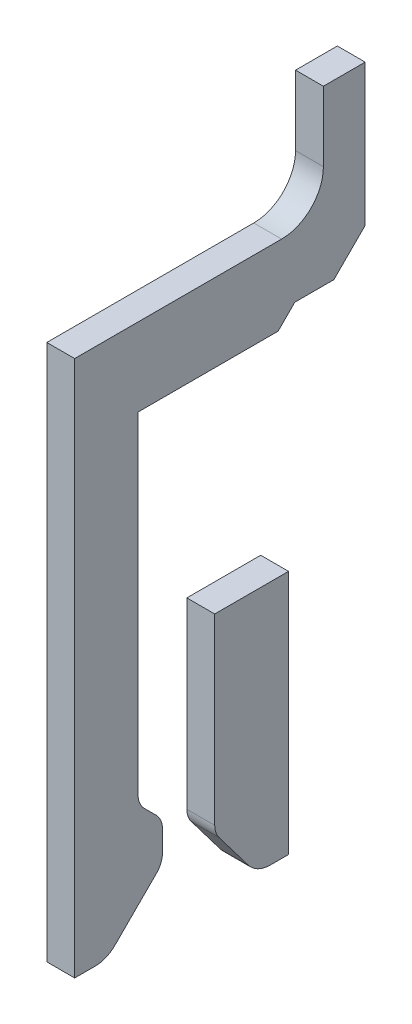
ISO-10303-21;
HEADER;
FILE_DESCRIPTION(('STEP AP214'),'2;1');
FILE_NAME('part.step','',(''),(''),'','','');
FILE_SCHEMA(('AUTOMOTIVE_DESIGN { 1 0 10303 214 1 1 1 1 }'));
ENDSEC;
DATA;
#1=APPLICATION_CONTEXT('core data for automotive mechanical design processes');
#2=APPLICATION_PROTOCOL_DEFINITION('international standard','automotive_design',2000,#1);
#3=PRODUCT_CONTEXT('',#1,'mechanical');
#4=PRODUCT('Part','Part','',(#3));
#5=PRODUCT_RELATED_PRODUCT_CATEGORY('part','',(#4));
#6=PRODUCT_DEFINITION_FORMATION('','',#4);
#7=PRODUCT_DEFINITION_CONTEXT('part definition',#1,'design');
#8=PRODUCT_DEFINITION('design','',#6,#7);
#9=PRODUCT_DEFINITION_SHAPE('','',#8);
#10=(LENGTH_UNIT() NAMED_UNIT(*) SI_UNIT(.MILLI.,.METRE.));
#11=(NAMED_UNIT(*) PLANE_ANGLE_UNIT() SI_UNIT($,.RADIAN.));
#12=(NAMED_UNIT(*) SI_UNIT($,.STERADIAN.) SOLID_ANGLE_UNIT());
#13=UNCERTAINTY_MEASURE_WITH_UNIT(LENGTH_MEASURE(1.E-05),#10,'distance_accuracy_value','');
#14=(GEOMETRIC_REPRESENTATION_CONTEXT(3) GLOBAL_UNCERTAINTY_ASSIGNED_CONTEXT((#13)) GLOBAL_UNIT_ASSIGNED_CONTEXT((#10,
#11,#12)) REPRESENTATION_CONTEXT('',''));
#15=CARTESIAN_POINT('',(0.,0.,0.));
#16=DIRECTION('',(0.,0.,1.));
#17=DIRECTION('',(1.,0.,0.));
#18=AXIS2_PLACEMENT_3D('',#15,#16,#17);
#19=CARTESIAN_POINT('',(7.97499934,-18.47500066,-9.725784001378E-08));
#20=DIRECTION('',(1.,0.,0.));
#21=DIRECTION('',(0.,0.,-1.));
#22=AXIS2_PLACEMENT_3D('',#19,#20,#21);
#23=PLANE('',#22);
#24=DIRECTION('',(0.,-4.37113879947E-08,0.999999999999999));
#25=VECTOR('',#24,1.);
#26=CARTESIAN_POINT('',(7.97499934,-14.62500066,7.103100429878E-08));
#27=LINE('',#26,#25);
#28=CARTESIAN_POINT('',(7.97499934,-14.6250007511327,2.08500007103085));
#29=VERTEX_POINT('',#28);
#30=CARTESIAN_POINT('',(7.97499934,-14.6250006862268,0.600000071030792));
#31=VERTEX_POINT('',#30);
#32=EDGE_CURVE('P0_E204',#29,#31,#27,.F.);
#33=ORIENTED_EDGE('',*,*,#32,.F.);
#34=DIRECTION('',(0.,-0.999999999999999,-4.371138828674E-08));
#35=VECTOR('',#34,1.);
#36=CARTESIAN_POINT('',(7.97499934,-18.47500075113,2.084999902742));
#37=LINE('',#36,#35);
#38=CARTESIAN_POINT('',(7.97499934,-18.4750007511355,2.08499995883833));
#39=VERTEX_POINT('',#38);
#40=EDGE_CURVE('P0_E222',#39,#29,#37,.F.);
#41=ORIENTED_EDGE('',*,*,#40,.F.);
#42=DIRECTION('',(0.,0.,-1.));
#43=VECTOR('',#42,1.);
#44=CARTESIAN_POINT('',(7.97499934,-18.47500075113,-9.725784001378E-08));
#45=LINE('',#44,#43);
#46=CARTESIAN_POINT('',(7.97499934,-18.475000747915,1.937842619588));
#47=VERTEX_POINT('',#46);
#48=EDGE_CURVE('P0_E101',#39,#47,#45,.T.);
#49=ORIENTED_EDGE('',*,*,#48,.T.);
#50=CARTESIAN_POINT('',(7.97499934,-18.2750007447,1.937842623959));
#51=DIRECTION('',(1.,0.,0.));
#52=DIRECTION('',(0.,0.,-1.));
#53=AXIS2_PLACEMENT_3D('',#50,#51,#52);
#54=CIRCLE('',#53,0.2);
#55=CARTESIAN_POINT('',(7.97499934,-18.4164220947576,1.79642126154002));
#56=VERTEX_POINT('',#55);
#57=EDGE_CURVE('P0_E20',#47,#56,#54,.T.);
#58=ORIENTED_EDGE('',*,*,#57,.T.);
#59=DIRECTION('',(0.,0.707106812096149,-0.707106750276945));
#60=VECTOR('',#59,1.);
#61=CARTESIAN_POINT('',(7.97499934,-18.41642209476,1.79642126154));
#62=LINE('',#61,#60);
#63=CARTESIAN_POINT('',(7.97499934,-18.1189347083395,1.49893390112953));
#64=VERTEX_POINT('',#63);
#65=EDGE_CURVE('P0_E106',#56,#64,#62,.T.);
#66=ORIENTED_EDGE('',*,*,#65,.T.);
#67=CARTESIAN_POINT('',(7.97499934,-18.0128686958,1.604999922943));
#68=DIRECTION('',(1.,0.,0.));
#69=DIRECTION('',(0.,0.,-1.));
#70=AXIS2_PLACEMENT_3D('',#67,#68,#69);
#71=CIRCLE('',#70,0.15);
#72=CARTESIAN_POINT('',(7.97499934,-18.0128686892416,1.45499992294215));
#73=VERTEX_POINT('',#72);
#74=EDGE_CURVE('P0_E118',#73,#64,#71,.F.);
#75=ORIENTED_EDGE('',*,*,#74,.F.);
#76=DIRECTION('',(0.,0.999999999999999,4.371138828674E-08));
#77=VECTOR('',#76,1.);
#78=CARTESIAN_POINT('',(7.97499934,-16.6500007236,1.454999982515));
#79=LINE('',#78,#77);
#80=CARTESIAN_POINT('',(7.97499934,-17.8628686925216,1.45499992949893));
#81=VERTEX_POINT('',#80);
#82=EDGE_CURVE('P0_E120',#81,#73,#79,.F.);
#83=ORIENTED_EDGE('',*,*,#82,.F.);
#84=CARTESIAN_POINT('',(7.97499934,-17.8628686958,1.604999929499));
#85=DIRECTION('',(1.,0.,0.));
#86=DIRECTION('',(0.,0.,-1.));
#87=AXIS2_PLACEMENT_3D('',#84,#85,#86);
#88=CIRCLE('',#87,0.15);
#89=CARTESIAN_POINT('',(7.97499934,-17.7568026739824,1.49893391695717));
#90=VERTEX_POINT('',#89);
#91=EDGE_CURVE('P0_E209',#90,#81,#88,.F.);
#92=ORIENTED_EDGE('',*,*,#91,.F.);
#93=DIRECTION('',(0.,0.707106750278047,0.707106812095047));
#94=VECTOR('',#93,1.);
#95=CARTESIAN_POINT('',(7.97499934,-17.95286868259,1.302867891209));
#96=LINE('',#95,#94);
#97=CARTESIAN_POINT('',(7.97499934,-17.6696706434333,1.58606595512357));
#98=VERTEX_POINT('',#97);
#99=EDGE_CURVE('P0_E176',#98,#90,#96,.F.);
#100=ORIENTED_EDGE('',*,*,#99,.F.);
#101=CARTESIAN_POINT('',(7.97499934,-17.56360462162,1.479999942581));
#102=DIRECTION('',(1.,0.,0.));
#103=DIRECTION('',(0.,0.,-1.));
#104=AXIS2_PLACEMENT_3D('',#101,#102,#103);
#105=CIRCLE('',#104,0.15);
#106=CARTESIAN_POINT('',(7.97499934,-17.5636046281784,1.62999994258011));
#107=VERTEX_POINT('',#106);
#108=EDGE_CURVE('P0_E173',#98,#107,#105,.F.);
#109=ORIENTED_EDGE('',*,*,#108,.T.);
#110=DIRECTION('',(0.,0.999999999999999,4.371138854226E-08));
#111=VECTOR('',#110,1.);
#112=CARTESIAN_POINT('',(7.97499934,-16.65000073125,1.629999982515));
#113=LINE('',#112,#111);
#114=CARTESIAN_POINT('',(7.97499934,-15.1850007312496,1.63000004655273));
#115=VERTEX_POINT('',#114);
#116=EDGE_CURVE('P0_E171',#115,#107,#113,.F.);
#117=ORIENTED_EDGE('',*,*,#116,.F.);
#118=DIRECTION('',(0.,4.371138828674E-08,-0.999999999999999));
#119=VECTOR('',#118,1.);
#120=CARTESIAN_POINT('',(7.97499934,-15.18500066,4.655262744959E-08));
#121=LINE('',#120,#119);
#122=CARTESIAN_POINT('',(7.97499934,-15.1850006873171,0.625000046557213));
#123=VERTEX_POINT('',#122);
#124=EDGE_CURVE('P0_E165',#123,#115,#121,.F.);
#125=ORIENTED_EDGE('',*,*,#124,.F.);
#126=DIRECTION('',(0.,0.707106812095047,-0.707106750278047));
#127=VECTOR('',#126,1.);
#128=CARTESIAN_POINT('',(7.97499934,-15.60500070567,1.045000028194));
#129=LINE('',#128,#127);
#130=CARTESIAN_POINT('',(7.97499934,-15.0650006820729,0.505000051799395));
#131=VERTEX_POINT('',#130);
#132=EDGE_CURVE('P0_E159',#131,#123,#129,.F.);
#133=ORIENTED_EDGE('',*,*,#132,.F.);
#134=DIRECTION('',(0.,4.371138828674E-08,-0.999999999999999));
#135=VECTOR('',#134,1.);
#136=CARTESIAN_POINT('',(7.97499934,-15.06500066,5.1797994044E-08));
#137=LINE('',#136,#135);
#138=CARTESIAN_POINT('',(7.97499934,-15.0650006698306,0.22500005179963));
#139=VERTEX_POINT('',#138);
#140=EDGE_CURVE('P0_E153',#139,#131,#137,.F.);
#141=ORIENTED_EDGE('',*,*,#140,.F.);
#142=DIRECTION('',(0.,0.707106812095047,-0.707106750278047));
#143=VECTOR('',#142,1.);
#144=CARTESIAN_POINT('',(7.97499934,-15.74500069955,0.905000022074));
#145=LINE('',#144,#143);
#146=CARTESIAN_POINT('',(7.97499934,-14.8400006599986,6.163443197108E-08));
#147=VERTEX_POINT('',#146);
#148=EDGE_CURVE('P0_E147',#147,#139,#145,.F.);
#149=ORIENTED_EDGE('',*,*,#148,.F.);
#150=DIRECTION('',(0.,0.999999999999999,4.371138828674E-08));
#151=VECTOR('',#150,1.);
#152=CARTESIAN_POINT('',(7.97499934,-16.65000066,-1.748455639048E-08));
#153=LINE('',#152,#151);
#154=CARTESIAN_POINT('',(7.97499934,-13.82500066,1.06000115519587E-07));
#155=VERTEX_POINT('',#154);
#156=EDGE_CURVE('P0_E141',#155,#147,#153,.F.);
#157=ORIENTED_EDGE('',*,*,#156,.F.);
#158=DIRECTION('',(0.,-4.371138828674E-08,0.999999999999999));
#159=VECTOR('',#158,1.);
#160=CARTESIAN_POINT('',(7.97499934,-13.82500066,1.060001155196E-07));
#161=LINE('',#160,#159);
#162=CARTESIAN_POINT('',(7.97499934,-13.8250006731111,0.300000105999672));
#163=VERTEX_POINT('',#162);
#164=EDGE_CURVE('P0_E135',#163,#155,#161,.F.);
#165=ORIENTED_EDGE('',*,*,#164,.F.);
#166=DIRECTION('',(0.,-0.999999999999999,-4.371138828674E-08));
#167=VECTOR('',#166,1.);
#168=CARTESIAN_POINT('',(7.97499934,-16.65000067311,0.299999982515));
#169=LINE('',#168,#167);
#170=CARTESIAN_POINT('',(7.97499934,-14.3250006796633,0.300000084143989));
#171=VERTEX_POINT('',#170);
#172=EDGE_CURVE('P0_E128',#171,#163,#169,.F.);
#173=ORIENTED_EDGE('',*,*,#172,.F.);
#174=CARTESIAN_POINT('',(7.97499934,-14.32500068622,0.600000084144));
#175=DIRECTION('',(1.,0.,0.));
#176=DIRECTION('',(0.,0.,-1.));
#177=AXIS2_PLACEMENT_3D('',#174,#175,#176);
#178=CIRCLE('',#177,0.3);
#179=EDGE_CURVE('P0_E201',#171,#31,#178,.F.);
#180=ORIENTED_EDGE('',*,*,#179,.T.);
#181=EDGE_LOOP('',(#33,#41,#49,#58,#66,#75,#83,#92,#100,#109,#117,#125,#133,#141,#149,#157,#165,
#173,#180));
#182=FACE_BOUND('',#181,.T.);
#183=ADVANCED_FACE('P0_F17',(#182),#23,.T.);
#184=CARTESIAN_POINT('',(7.77499934,-18.0128686958,1.604999922943));
#185=DIRECTION('',(1.,0.,0.));
#186=DIRECTION('',(0.,0.,-1.));
#187=AXIS2_PLACEMENT_3D('',#184,#185,#186);
#188=CYLINDRICAL_SURFACE('',#187,0.15);
#189=CARTESIAN_POINT('',(7.77499934,-18.0128686958,1.604999922943));
#190=DIRECTION('',(1.,0.,0.));
#191=DIRECTION('',(0.,0.,-1.));
#192=AXIS2_PLACEMENT_3D('',#189,#190,#191);
#193=CIRCLE('',#192,0.15);
#194=CARTESIAN_POINT('',(7.77499934,-18.1189347083395,1.49893390112953));
#195=VERTEX_POINT('',#194);
#196=CARTESIAN_POINT('',(7.77499934,-18.01286869252,1.45499992294257));
#197=VERTEX_POINT('',#196);
#198=EDGE_CURVE('P0_E198',#195,#197,#193,.T.);
#199=ORIENTED_EDGE('',*,*,#198,.T.);
#200=DIRECTION('',(1.,0.,0.));
#201=VECTOR('',#200,1.);
#202=CARTESIAN_POINT('',(7.77499934,-18.01286868924,1.45499992294215));
#203=LINE('',#202,#201);
#204=EDGE_CURVE('P0_E181',#73,#197,#203,.F.);
#205=ORIENTED_EDGE('',*,*,#204,.F.);
#206=ORIENTED_EDGE('',*,*,#74,.T.);
#207=DIRECTION('',(1.,0.,0.));
#208=VECTOR('',#207,1.);
#209=CARTESIAN_POINT('',(7.77499934,-18.118934708338,1.49893390112999));
#210=LINE('',#209,#208);
#211=EDGE_CURVE('P0_E112',#195,#64,#210,.T.);
#212=ORIENTED_EDGE('',*,*,#211,.F.);
#213=EDGE_LOOP('',(#199,#205,#206,#212));
#214=FACE_BOUND('',#213,.T.);
#215=ADVANCED_FACE('P0_F364',(#214),#188,.T.);
#216=CARTESIAN_POINT('',(7.77499934,-16.6500007236,1.454999982515));
#217=DIRECTION('',(0.,4.371138828674E-08,-0.999999999999999));
#218=DIRECTION('',(0.,0.999999999999999,4.371138828674E-08));
#219=AXIS2_PLACEMENT_3D('',#216,#217,#218);
#220=PLANE('',#219);
#221=DIRECTION('',(0.,1.,0.));
#222=VECTOR('',#221,1.);
#223=CARTESIAN_POINT('',(7.77499934,-18.47500066,1.454999922943));
#224=LINE('',#223,#222);
#225=CARTESIAN_POINT('',(7.77499934,-17.8628686958,1.454999926221));
#226=VERTEX_POINT('',#225);
#227=EDGE_CURVE('P0_E197',#197,#226,#224,.T.);
#228=ORIENTED_EDGE('',*,*,#227,.T.);
#229=DIRECTION('',(1.,0.,0.));
#230=VECTOR('',#229,1.);
#231=CARTESIAN_POINT('',(7.77499934,-17.8628686958,1.454999929499));
#232=LINE('',#231,#230);
#233=EDGE_CURVE('P0_E179',#81,#226,#232,.F.);
#234=ORIENTED_EDGE('',*,*,#233,.F.);
#235=ORIENTED_EDGE('',*,*,#82,.T.);
#236=ORIENTED_EDGE('',*,*,#204,.T.);
#237=EDGE_LOOP('',(#228,#234,#235,#236));
#238=FACE_BOUND('',#237,.T.);
#239=ADVANCED_FACE('P0_F312',(#238),#220,.T.);
#240=CARTESIAN_POINT('',(7.77499934,-17.8628686958,1.604999929499));
#241=DIRECTION('',(1.,0.,0.));
#242=DIRECTION('',(0.,0.,-1.));
#243=AXIS2_PLACEMENT_3D('',#240,#241,#242);
#244=CYLINDRICAL_SURFACE('',#243,0.15);
#245=CARTESIAN_POINT('',(7.77499934,-17.8628686958,1.604999929499));
#246=DIRECTION('',(1.,0.,0.));
#247=DIRECTION('',(0.,0.,-1.));
#248=AXIS2_PLACEMENT_3D('',#245,#246,#247);
#249=CIRCLE('',#248,0.15);
#250=CARTESIAN_POINT('',(7.77499934,-17.756802673983,1.49893391695578));
#251=VERTEX_POINT('',#250);
#252=EDGE_CURVE('P0_E194',#226,#251,#249,.T.);
#253=ORIENTED_EDGE('',*,*,#252,.T.);
#254=DIRECTION('',(1.,0.,0.));
#255=VECTOR('',#254,1.);
#256=CARTESIAN_POINT('',(7.77499934,-17.7568026739808,1.49893391695878));
#257=LINE('',#256,#255);
#258=EDGE_CURVE('P0_E178',#90,#251,#257,.F.);
#259=ORIENTED_EDGE('',*,*,#258,.F.);
#260=ORIENTED_EDGE('',*,*,#91,.T.);
#261=ORIENTED_EDGE('',*,*,#233,.T.);
#262=EDGE_LOOP('',(#253,#259,#260,#261));
#263=FACE_BOUND('',#262,.T.);
#264=ADVANCED_FACE('P0_F310',(#263),#244,.T.);
#265=CARTESIAN_POINT('',(7.77499934,-17.95286868259,1.302867891209));
#266=DIRECTION('',(0.,0.707106812095047,-0.707106750278047));
#267=DIRECTION('',(0.,0.707106750278047,0.707106812095047));
#268=AXIS2_PLACEMENT_3D('',#265,#266,#267);
#269=PLANE('',#268);
#270=DIRECTION('',(0.,0.707106750291432,0.707106812081661));
#271=VECTOR('',#270,1.);
#272=CARTESIAN_POINT('',(7.77499934,-17.75680267398,1.498933916958));
#273=LINE('',#272,#271);
#274=CARTESIAN_POINT('',(7.77499934,-17.6696706434311,1.58606595512336));
#275=VERTEX_POINT('',#274);
#276=EDGE_CURVE('P0_E193',#251,#275,#273,.T.);
#277=ORIENTED_EDGE('',*,*,#276,.T.);
#278=DIRECTION('',(1.,0.,0.));
#279=VECTOR('',#278,1.);
#280=CARTESIAN_POINT('',(7.77499934,-17.6696706434325,1.58606595512448));
#281=LINE('',#280,#279);
#282=EDGE_CURVE('P0_E208',#275,#98,#281,.T.);
#283=ORIENTED_EDGE('',*,*,#282,.T.);
#284=ORIENTED_EDGE('',*,*,#99,.T.);
#285=ORIENTED_EDGE('',*,*,#258,.T.);
#286=EDGE_LOOP('',(#277,#283,#284,#285));
#287=FACE_BOUND('',#286,.T.);
#288=ADVANCED_FACE('P0_F303',(#287),#269,.T.);
#289=CARTESIAN_POINT('',(7.77499934,-17.56360462162,1.479999942581));
#290=DIRECTION('',(1.,0.,0.));
#291=DIRECTION('',(0.,0.,-1.));
#292=AXIS2_PLACEMENT_3D('',#289,#290,#291);
#293=CYLINDRICAL_SURFACE('',#292,0.15);
#294=ORIENTED_EDGE('',*,*,#282,.F.);
#295=CARTESIAN_POINT('',(7.77499934,-17.56360462162,1.479999942581));
#296=DIRECTION('',(1.,0.,0.));
#297=DIRECTION('',(0.,0.,-1.));
#298=AXIS2_PLACEMENT_3D('',#295,#296,#297);
#299=CIRCLE('',#298,0.15);
#300=CARTESIAN_POINT('',(7.77499934,-17.5636046249,1.62999994258055));
#301=VERTEX_POINT('',#300);
#302=EDGE_CURVE('P0_E189',#275,#301,#299,.F.);
#303=ORIENTED_EDGE('',*,*,#302,.T.);
#304=DIRECTION('',(1.,0.,0.));
#305=VECTOR('',#304,1.);
#306=CARTESIAN_POINT('',(7.77499934,-17.56360462818,1.6299999425801));
#307=LINE('',#306,#305);
#308=EDGE_CURVE('P0_E168',#107,#301,#307,.F.);
#309=ORIENTED_EDGE('',*,*,#308,.F.);
#310=ORIENTED_EDGE('',*,*,#108,.F.);
#311=EDGE_LOOP('',(#294,#303,#309,#310));
#312=FACE_BOUND('',#311,.T.);
#313=ADVANCED_FACE('P0_F359',(#312),#293,.F.);
#314=CARTESIAN_POINT('',(7.77499934,-16.65000073125,1.629999982515));
#315=DIRECTION('',(0.,4.371138854226E-08,-0.999999999999999));
#316=DIRECTION('',(0.,0.999999999999999,4.371138854226E-08));
#317=AXIS2_PLACEMENT_3D('',#314,#315,#316);
#318=PLANE('',#317);
#319=DIRECTION('',(0.,1.,0.));
#320=VECTOR('',#319,1.);
#321=CARTESIAN_POINT('',(7.77499934,-18.47500066,1.629999942581));
#322=LINE('',#321,#320);
#323=CARTESIAN_POINT('',(7.77499934,-15.1850007312499,1.62999997723833));
#324=VERTEX_POINT('',#323);
#325=EDGE_CURVE('P0_E192',#301,#324,#322,.T.);
#326=ORIENTED_EDGE('',*,*,#325,.T.);
#327=DIRECTION('',(1.,0.,0.));
#328=VECTOR('',#327,1.);
#329=CARTESIAN_POINT('',(7.77499934,-15.1850007312496,1.630000046553));
#330=LINE('',#329,#328);
#331=EDGE_CURVE('P0_E162',#115,#324,#330,.F.);
#332=ORIENTED_EDGE('',*,*,#331,.F.);
#333=ORIENTED_EDGE('',*,*,#116,.T.);
#334=ORIENTED_EDGE('',*,*,#308,.T.);
#335=EDGE_LOOP('',(#326,#332,#333,#334));
#336=FACE_BOUND('',#335,.T.);
#337=ADVANCED_FACE('P0_F352',(#336),#318,.T.);
#338=CARTESIAN_POINT('',(7.77499934,-15.18500066,4.655262744959E-08));
#339=DIRECTION('',(0.,-0.999999999999999,-4.371138828674E-08));
#340=DIRECTION('',(0.,4.371138828674E-08,-0.999999999999999));
#341=AXIS2_PLACEMENT_3D('',#338,#339,#340);
#342=PLANE('',#341);
#343=DIRECTION('',(0.,0.,-1.));
#344=VECTOR('',#343,1.);
#345=CARTESIAN_POINT('',(7.77499934,-15.18500073125,-9.725784001378E-08));
#346=LINE('',#345,#344);
#347=CARTESIAN_POINT('',(7.77499934,-15.1850007166053,0.625000075841069));
#348=VERTEX_POINT('',#347);
#349=EDGE_CURVE('P0_E283',#324,#348,#346,.T.);
#350=ORIENTED_EDGE('',*,*,#349,.T.);
#351=DIRECTION('',(1.,0.,0.));
#352=VECTOR('',#351,1.);
#353=CARTESIAN_POINT('',(7.77499934,-15.1850006873158,0.625000046557213));
#354=LINE('',#353,#352);
#355=EDGE_CURVE('P0_E156',#123,#348,#354,.F.);
#356=ORIENTED_EDGE('',*,*,#355,.F.);
#357=ORIENTED_EDGE('',*,*,#124,.T.);
#358=ORIENTED_EDGE('',*,*,#331,.T.);
#359=EDGE_LOOP('',(#350,#356,#357,#358));
#360=FACE_BOUND('',#359,.T.);
#361=ADVANCED_FACE('P0_F420',(#360),#342,.T.);
#362=CARTESIAN_POINT('',(7.77499934,-15.60500070567,1.045000028194));
#363=DIRECTION('',(0.,-0.707106750278047,-0.707106812095047));
#364=DIRECTION('',(0.,0.707106812095047,-0.707106750278047));
#365=AXIS2_PLACEMENT_3D('',#362,#363,#364);
#366=PLANE('',#365);
#367=DIRECTION('',(0.,0.707106812107738,-0.707106750265355));
#368=VECTOR('',#367,1.);
#369=CARTESIAN_POINT('',(7.77499934,-15.18500068732,0.625000046553));
#370=LINE('',#369,#368);
#371=CARTESIAN_POINT('',(7.77499934,-15.0650006820714,0.505000051798));
#372=VERTEX_POINT('',#371);
#373=EDGE_CURVE('P0_E274',#348,#372,#370,.T.);
#374=ORIENTED_EDGE('',*,*,#373,.T.);
#375=DIRECTION('',(1.,0.,0.));
#376=VECTOR('',#375,1.);
#377=CARTESIAN_POINT('',(7.77499934,-15.0650006820743,0.505000051798));
#378=LINE('',#377,#376);
#379=EDGE_CURVE('P0_E150',#131,#372,#378,.F.);
#380=ORIENTED_EDGE('',*,*,#379,.F.);
#381=ORIENTED_EDGE('',*,*,#132,.T.);
#382=ORIENTED_EDGE('',*,*,#355,.T.);
#383=EDGE_LOOP('',(#374,#380,#381,#382));
#384=FACE_BOUND('',#383,.T.);
#385=ADVANCED_FACE('P0_F417',(#384),#366,.T.);
#386=CARTESIAN_POINT('',(7.77499934,-15.06500066,5.1797994044E-08));
#387=DIRECTION('',(0.,-0.999999999999999,-4.371138828674E-08));
#388=DIRECTION('',(0.,4.371138828674E-08,-0.999999999999999));
#389=AXIS2_PLACEMENT_3D('',#386,#387,#388);
#390=PLANE('',#389);
#391=DIRECTION('',(0.,0.,-1.));
#392=VECTOR('',#391,1.);
#393=CARTESIAN_POINT('',(7.77499934,-15.06500068207,-9.725784001378E-08));
#394=LINE('',#393,#392);
#395=CARTESIAN_POINT('',(7.77499934,-15.0650006779895,0.225000059958542));
#396=VERTEX_POINT('',#395);
#397=EDGE_CURVE('P0_E265',#372,#396,#394,.T.);
#398=ORIENTED_EDGE('',*,*,#397,.T.);
#399=DIRECTION('',(1.,0.,0.));
#400=VECTOR('',#399,1.);
#401=CARTESIAN_POINT('',(7.77499934,-15.0650006698284,0.22500005179963));
#402=LINE('',#401,#400);
#403=EDGE_CURVE('P0_E144',#139,#396,#402,.F.);
#404=ORIENTED_EDGE('',*,*,#403,.F.);
#405=ORIENTED_EDGE('',*,*,#140,.T.);
#406=ORIENTED_EDGE('',*,*,#379,.T.);
#407=EDGE_LOOP('',(#398,#404,#405,#406));
#408=FACE_BOUND('',#407,.T.);
#409=ADVANCED_FACE('P0_F413',(#408),#390,.T.);
#410=CARTESIAN_POINT('',(7.77499934,-15.74500069955,0.905000022074));
#411=DIRECTION('',(0.,-0.707106750278047,-0.707106812095047));
#412=DIRECTION('',(0.,0.707106812095047,-0.707106750278047));
#413=AXIS2_PLACEMENT_3D('',#410,#411,#412);
#414=PLANE('',#413);
#415=DIRECTION('',(0.,0.707106812087203,-0.707106750285891));
#416=VECTOR('',#415,1.);
#417=CARTESIAN_POINT('',(7.77499934,-15.06500066983,0.225000051798));
#418=LINE('',#417,#416);
#419=CARTESIAN_POINT('',(7.77499934,-14.84000066,6.16330563353605E-08));
#420=VERTEX_POINT('',#419);
#421=EDGE_CURVE('P0_E256',#396,#420,#418,.T.);
#422=ORIENTED_EDGE('',*,*,#421,.T.);
#423=DIRECTION('',(1.,0.,0.));
#424=VECTOR('',#423,1.);
#425=CARTESIAN_POINT('',(7.77499934,-14.84000066,6.16330564085194E-08));
#426=LINE('',#425,#424);
#427=EDGE_CURVE('P0_E138',#147,#420,#426,.F.);
#428=ORIENTED_EDGE('',*,*,#427,.F.);
#429=ORIENTED_EDGE('',*,*,#148,.T.);
#430=ORIENTED_EDGE('',*,*,#403,.T.);
#431=EDGE_LOOP('',(#422,#428,#429,#430));
#432=FACE_BOUND('',#431,.T.);
#433=ADVANCED_FACE('P0_F409',(#432),#414,.T.);
#434=CARTESIAN_POINT('',(7.77499934,-16.65000066,-1.748455639048E-08));
#435=DIRECTION('',(0.,4.371138828674E-08,-0.999999999999999));
#436=DIRECTION('',(0.,0.999999999999999,4.371138828674E-08));
#437=AXIS2_PLACEMENT_3D('',#434,#435,#436);
#438=PLANE('',#437);
#439=DIRECTION('',(0.,1.,0.));
#440=VECTOR('',#439,1.);
#441=CARTESIAN_POINT('',(7.77499934,-18.47500066,6.163305630009E-08));
#442=LINE('',#441,#440);
#443=CARTESIAN_POINT('',(7.77499934,-13.82500066,7.64220760399267E-08));
#444=VERTEX_POINT('',#443);
#445=EDGE_CURVE('P0_E247',#420,#444,#442,.T.);
#446=ORIENTED_EDGE('',*,*,#445,.T.);
#447=DIRECTION('',(1.,0.,0.));
#448=VECTOR('',#447,1.);
#449=CARTESIAN_POINT('',(7.77499934,-13.82500066,1.060001155196E-07));
#450=LINE('',#449,#448);
#451=EDGE_CURVE('P0_E132',#155,#444,#450,.F.);
#452=ORIENTED_EDGE('',*,*,#451,.F.);
#453=ORIENTED_EDGE('',*,*,#156,.T.);
#454=ORIENTED_EDGE('',*,*,#427,.T.);
#455=EDGE_LOOP('',(#446,#452,#453,#454));
#456=FACE_BOUND('',#455,.T.);
#457=ADVANCED_FACE('P0_F403',(#456),#438,.T.);
#458=CARTESIAN_POINT('',(7.77499934,-13.82500066,1.060001155196E-07));
#459=DIRECTION('',(0.,0.999999999999999,4.371138828674E-08));
#460=DIRECTION('',(0.,-4.371138828674E-08,0.999999999999999));
#461=AXIS2_PLACEMENT_3D('',#458,#459,#460);
#462=PLANE('',#461);
#463=DIRECTION('',(0.,0.,-1.));
#464=VECTOR('',#463,1.);
#465=CARTESIAN_POINT('',(7.77499934,-13.82500066,-9.725784001378E-08));
#466=LINE('',#465,#464);
#467=CARTESIAN_POINT('',(7.77499934,-13.82500066437,0.300000105999891));
#468=VERTEX_POINT('',#467);
#469=EDGE_CURVE('P0_E244',#444,#468,#466,.F.);
#470=ORIENTED_EDGE('',*,*,#469,.T.);
#471=DIRECTION('',(1.,0.,0.));
#472=VECTOR('',#471,1.);
#473=CARTESIAN_POINT('',(7.77499934,-13.82500067311,0.300000105999672));
#474=LINE('',#473,#472);
#475=EDGE_CURVE('P0_E131',#163,#468,#474,.F.);
#476=ORIENTED_EDGE('',*,*,#475,.F.);
#477=ORIENTED_EDGE('',*,*,#164,.T.);
#478=ORIENTED_EDGE('',*,*,#451,.T.);
#479=EDGE_LOOP('',(#470,#476,#477,#478));
#480=FACE_BOUND('',#479,.T.);
#481=ADVANCED_FACE('P0_F399',(#480),#462,.T.);
#482=CARTESIAN_POINT('',(7.77499934,-16.65000067311,0.299999982515));
#483=DIRECTION('',(0.,-4.371138828674E-08,0.999999999999999));
#484=DIRECTION('',(0.,-0.999999999999999,-4.371138828674E-08));
#485=AXIS2_PLACEMENT_3D('',#482,#483,#484);
#486=PLANE('',#485);
#487=DIRECTION('',(0.,1.,0.));
#488=VECTOR('',#487,1.);
#489=CARTESIAN_POINT('',(7.77499934,-18.47500066,0.300000106));
#490=LINE('',#489,#488);
#491=CARTESIAN_POINT('',(7.77499934,-14.32500068622,0.300000095072));
#492=VERTEX_POINT('',#491);
#493=EDGE_CURVE('P0_E188',#468,#492,#490,.F.);
#494=ORIENTED_EDGE('',*,*,#493,.T.);
#495=DIRECTION('',(1.,0.,0.));
#496=VECTOR('',#495,1.);
#497=CARTESIAN_POINT('',(7.77499934,-14.32500068622,0.300000084144));
#498=LINE('',#497,#496);
#499=EDGE_CURVE('P0_E205',#492,#171,#498,.T.);
#500=ORIENTED_EDGE('',*,*,#499,.T.);
#501=ORIENTED_EDGE('',*,*,#172,.T.);
#502=ORIENTED_EDGE('',*,*,#475,.T.);
#503=EDGE_LOOP('',(#494,#500,#501,#502));
#504=FACE_BOUND('',#503,.T.);
#505=ADVANCED_FACE('P0_F394',(#504),#486,.T.);
#506=CARTESIAN_POINT('',(7.77499934,-14.32500068622,0.600000084144));
#507=DIRECTION('',(1.,0.,0.));
#508=DIRECTION('',(0.,0.,-1.));
#509=AXIS2_PLACEMENT_3D('',#506,#507,#508);
#510=CYLINDRICAL_SURFACE('',#509,0.3);
#511=ORIENTED_EDGE('',*,*,#499,.F.);
#512=CARTESIAN_POINT('',(7.77499934,-14.32500068622,0.600000084144));
#513=DIRECTION('',(1.,0.,0.));
#514=DIRECTION('',(0.,0.,-1.));
#515=AXIS2_PLACEMENT_3D('',#512,#513,#514);
#516=CIRCLE('',#515,0.3);
#517=CARTESIAN_POINT('',(7.77499934,-14.6250006862234,0.6000000775875));
#518=VERTEX_POINT('',#517);
#519=EDGE_CURVE('P0_E184',#492,#518,#516,.F.);
#520=ORIENTED_EDGE('',*,*,#519,.T.);
#521=DIRECTION('',(1.,0.,0.));
#522=VECTOR('',#521,1.);
#523=CARTESIAN_POINT('',(7.77499934,-14.6250006862268,0.600000071031));
#524=LINE('',#523,#522);
#525=EDGE_CURVE('P0_E226',#31,#518,#524,.F.);
#526=ORIENTED_EDGE('',*,*,#525,.F.);
#527=ORIENTED_EDGE('',*,*,#179,.F.);
#528=EDGE_LOOP('',(#511,#520,#526,#527));
#529=FACE_BOUND('',#528,.T.);
#530=ADVANCED_FACE('P0_F423',(#529),#510,.F.);
#531=CARTESIAN_POINT('',(7.77499934,-14.62500066,7.103100429878E-08));
#532=DIRECTION('',(0.,0.999999999999999,4.37113879947E-08));
#533=DIRECTION('',(0.,-4.37113879947E-08,0.999999999999999));
#534=AXIS2_PLACEMENT_3D('',#531,#532,#533);
#535=PLANE('',#534);
#536=DIRECTION('',(0.,0.,-1.));
#537=VECTOR('',#536,1.);
#538=CARTESIAN_POINT('',(7.77499934,-14.62500068622,-9.725784001378E-08));
#539=LINE('',#538,#537);
#540=CARTESIAN_POINT('',(7.77499934,-14.6250007078567,2.08500007103095));
#541=VERTEX_POINT('',#540);
#542=EDGE_CURVE('P0_E187',#518,#541,#539,.F.);
#543=ORIENTED_EDGE('',*,*,#542,.T.);
#544=DIRECTION('',(1.,0.,0.));
#545=VECTOR('',#544,1.);
#546=CARTESIAN_POINT('',(13.49999934,-14.62500075113,2.08500007103085));
#547=LINE('',#546,#545);
#548=EDGE_CURVE('P0_E225',#29,#541,#547,.F.);
#549=ORIENTED_EDGE('',*,*,#548,.F.);
#550=ORIENTED_EDGE('',*,*,#32,.T.);
#551=ORIENTED_EDGE('',*,*,#525,.T.);
#552=EDGE_LOOP('',(#543,#549,#550,#551));
#553=FACE_BOUND('',#552,.T.);
#554=ADVANCED_FACE('P0_F336',(#553),#535,.T.);
#555=CARTESIAN_POINT('',(13.49999934,-18.47500075113,2.084999902742));
#556=DIRECTION('',(0.,-4.371138828674E-08,0.999999999999999));
#557=DIRECTION('',(0.,-0.999999999999999,-4.371138828674E-08));
#558=AXIS2_PLACEMENT_3D('',#555,#556,#557);
#559=PLANE('',#558);
#560=DIRECTION('',(0.,1.,0.));
#561=VECTOR('',#560,1.);
#562=CARTESIAN_POINT('',(7.77499934,-18.47500066,2.085000071031));
#563=LINE('',#562,#561);
#564=CARTESIAN_POINT('',(7.77499934,-18.4750007511327,2.08500001493467));
#565=VERTEX_POINT('',#564);
#566=EDGE_CURVE('P0_E323',#541,#565,#563,.F.);
#567=ORIENTED_EDGE('',*,*,#566,.T.);
#568=DIRECTION('',(1.,0.,0.));
#569=VECTOR('',#568,1.);
#570=CARTESIAN_POINT('',(13.49999934,-18.4750007511382,2.084999902742));
#571=LINE('',#570,#569);
#572=EDGE_CURVE('P0_E318',#39,#565,#571,.F.);
#573=ORIENTED_EDGE('',*,*,#572,.F.);
#574=ORIENTED_EDGE('',*,*,#40,.T.);
#575=ORIENTED_EDGE('',*,*,#548,.T.);
#576=EDGE_LOOP('',(#567,#573,#574,#575));
#577=FACE_BOUND('',#576,.T.);
#578=ADVANCED_FACE('P0_F330',(#577),#559,.T.);
#579=CARTESIAN_POINT('',(13.49999934,-18.47500066,-9.725784001378E-08));
#580=DIRECTION('',(0.,-0.999999999999999,-4.371138828674E-08));
#581=DIRECTION('',(0.,4.371138828674E-08,-0.999999999999999));
#582=AXIS2_PLACEMENT_3D('',#579,#580,#581);
#583=PLANE('',#582);
#584=ORIENTED_EDGE('',*,*,#48,.F.);
#585=ORIENTED_EDGE('',*,*,#572,.T.);
#586=DIRECTION('',(0.,0.,-1.));
#587=VECTOR('',#586,1.);
#588=CARTESIAN_POINT('',(7.77499934,-18.47500075113,-9.725784001378E-08));
#589=LINE('',#588,#587);
#590=CARTESIAN_POINT('',(7.77499934,-18.475000747915,1.937842619588));
#591=VERTEX_POINT('',#590);
#592=EDGE_CURVE('P0_E183',#565,#591,#589,.T.);
#593=ORIENTED_EDGE('',*,*,#592,.T.);
#594=DIRECTION('',(1.,0.,0.));
#595=VECTOR('',#594,1.);
#596=CARTESIAN_POINT('',(13.49999934,-18.4750007447,1.937842615217));
#597=LINE('',#596,#595);
#598=EDGE_CURVE('P0_E113',#47,#591,#597,.F.);
#599=ORIENTED_EDGE('',*,*,#598,.F.);
#600=EDGE_LOOP('',(#584,#585,#593,#599));
#601=FACE_BOUND('',#600,.T.);
#602=ADVANCED_FACE('P0_F366',(#601),#583,.T.);
#603=CARTESIAN_POINT('',(13.49999934,-18.2750007447,1.937842623959));
#604=DIRECTION('',(1.,0.,0.));
#605=DIRECTION('',(0.,0.,-1.));
#606=AXIS2_PLACEMENT_3D('',#603,#604,#605);
#607=CYLINDRICAL_SURFACE('',#606,0.2);
#608=ORIENTED_EDGE('',*,*,#57,.F.);
#609=ORIENTED_EDGE('',*,*,#598,.T.);
#610=CARTESIAN_POINT('',(7.77499934,-18.2750007447,1.937842623959));
#611=DIRECTION('',(1.,0.,0.));
#612=DIRECTION('',(0.,0.,-1.));
#613=AXIS2_PLACEMENT_3D('',#610,#611,#612);
#614=CIRCLE('',#613,0.2);
#615=CARTESIAN_POINT('',(7.77499934,-18.4164220947576,1.79642126154002));
#616=VERTEX_POINT('',#615);
#617=EDGE_CURVE('P0_E26',#591,#616,#614,.T.);
#618=ORIENTED_EDGE('',*,*,#617,.T.);
#619=DIRECTION('',(1.,0.,0.));
#620=VECTOR('',#619,1.);
#621=CARTESIAN_POINT('',(7.77499934,-18.4164220947575,1.79642126154245));
#622=LINE('',#621,#620);
#623=EDGE_CURVE('P0_E34',#56,#616,#622,.F.);
#624=ORIENTED_EDGE('',*,*,#623,.F.);
#625=EDGE_LOOP('',(#608,#609,#618,#624));
#626=FACE_BOUND('',#625,.T.);
#627=ADVANCED_FACE('P0_F110',(#626),#607,.T.);
#628=CARTESIAN_POINT('',(7.77499934,-16.63500066065,0.01499998317111));
#629=DIRECTION('',(0.,-0.707106750278047,-0.707106812095047));
#630=DIRECTION('',(0.,0.707106812095047,-0.707106750278047));
#631=AXIS2_PLACEMENT_3D('',#628,#629,#630);
#632=PLANE('',#631);
#633=DIRECTION('',(0.,0.707106812096149,-0.707106750276945));
#634=VECTOR('',#633,1.);
#635=CARTESIAN_POINT('',(7.77499934,-18.41642209476,1.79642126154));
#636=LINE('',#635,#634);
#637=EDGE_CURVE('P0_E11',#616,#195,#636,.T.);
#638=ORIENTED_EDGE('',*,*,#637,.T.);
#639=ORIENTED_EDGE('',*,*,#211,.T.);
#640=ORIENTED_EDGE('',*,*,#65,.F.);
#641=ORIENTED_EDGE('',*,*,#623,.T.);
#642=EDGE_LOOP('',(#638,#639,#640,#641));
#643=FACE_BOUND('',#642,.T.);
#644=ADVANCED_FACE('P0_F116',(#643),#632,.T.);
#645=CARTESIAN_POINT('',(7.77499934,-18.47500066,-9.725784001378E-08));
#646=DIRECTION('',(1.,0.,0.));
#647=DIRECTION('',(0.,0.,-1.));
#648=AXIS2_PLACEMENT_3D('',#645,#646,#647);
#649=PLANE('',#648);
#650=ORIENTED_EDGE('',*,*,#617,.F.);
#651=ORIENTED_EDGE('',*,*,#592,.F.);
#652=ORIENTED_EDGE('',*,*,#566,.F.);
#653=ORIENTED_EDGE('',*,*,#542,.F.);
#654=ORIENTED_EDGE('',*,*,#519,.F.);
#655=ORIENTED_EDGE('',*,*,#493,.F.);
#656=ORIENTED_EDGE('',*,*,#469,.F.);
#657=ORIENTED_EDGE('',*,*,#445,.F.);
#658=ORIENTED_EDGE('',*,*,#421,.F.);
#659=ORIENTED_EDGE('',*,*,#397,.F.);
#660=ORIENTED_EDGE('',*,*,#373,.F.);
#661=ORIENTED_EDGE('',*,*,#349,.F.);
#662=ORIENTED_EDGE('',*,*,#325,.F.);
#663=ORIENTED_EDGE('',*,*,#302,.F.);
#664=ORIENTED_EDGE('',*,*,#276,.F.);
#665=ORIENTED_EDGE('',*,*,#252,.F.);
#666=ORIENTED_EDGE('',*,*,#227,.F.);
#667=ORIENTED_EDGE('',*,*,#198,.F.);
#668=ORIENTED_EDGE('',*,*,#637,.F.);
#669=EDGE_LOOP('',(#650,#651,#652,#653,#654,#655,#656,#657,#658,#659,#660,#661,#662,#663,#664,
#665,#666,#667,#668));
#670=FACE_BOUND('',#669,.T.);
#671=ADVANCED_FACE('P0_F307',(#670),#649,.F.);
#672=CLOSED_SHELL('',(#183,#215,#239,#264,#288,#313,#337,#361,#385,#409,#433,#457,#481,#505,
#530,#554,#578,#602,#627,#644,#671));
#673=MANIFOLD_SOLID_BREP('P0_B1',#672);
#674=CARTESIAN_POINT('',(7.77499934,-18.47500066,-9.725784001378E-08));
#675=DIRECTION('',(1.,0.,0.));
#676=DIRECTION('',(0.,0.,-1.));
#677=AXIS2_PLACEMENT_3D('',#674,#675,#676);
#678=PLANE('',#677);
#679=CARTESIAN_POINT('',(7.77499934,-18.27500068975,0.680598091235));
#680=DIRECTION('',(-1.,0.,0.));
#681=DIRECTION('',(0.,0.,1.));
#682=AXIS2_PLACEMENT_3D('',#679,#680,#681);
#683=CIRCLE('',#682,0.2);
#684=CARTESIAN_POINT('',(7.77499934,-18.3957659022013,0.840021312445508));
#685=VERTEX_POINT('',#684);
#686=CARTESIAN_POINT('',(7.77499934,-18.4750006897499,0.680598082492361));
#687=VERTEX_POINT('',#686);
#688=EDGE_CURVE('P1_E118',#685,#687,#683,.F.);
#689=ORIENTED_EDGE('',*,*,#688,.F.);
#690=DIRECTION('',(0.,0.79711610605487,0.603826062262901));
#691=VECTOR('',#690,1.);
#692=CARTESIAN_POINT('',(7.77499934,-17.69083562011,1.374015385794));
#693=LINE('',#692,#691);
#694=CARTESIAN_POINT('',(7.77499934,-18.1191423470092,1.04956733816397));
#695=VERTEX_POINT('',#694);
#696=EDGE_CURVE('P1_E119',#685,#695,#693,.T.);
#697=ORIENTED_EDGE('',*,*,#696,.T.);
#698=CARTESIAN_POINT('',(7.77499934,-18.02856843767,0.929999922256));
#699=DIRECTION('',(1.,0.,0.));
#700=DIRECTION('',(0.,0.,-1.));
#701=AXIS2_PLACEMENT_3D('',#698,#699,#700);
#702=CIRCLE('',#701,0.15);
#703=CARTESIAN_POINT('',(7.77499934,-18.028568440945,1.079999950965));
#704=VERTEX_POINT('',#703);
#705=EDGE_CURVE('P1_E20',#704,#695,#702,.T.);
#706=ORIENTED_EDGE('',*,*,#705,.F.);
#707=DIRECTION('',(0.,1.,0.));
#708=VECTOR('',#707,1.);
#709=CARTESIAN_POINT('',(7.77499934,-18.47500066,1.079999979674));
#710=LINE('',#709,#708);
#711=CARTESIAN_POINT('',(7.77499934,-16.71500069176,1.07999997967392));
#712=VERTEX_POINT('',#711);
#713=EDGE_CURVE('P1_E64',#712,#704,#710,.F.);
#714=ORIENTED_EDGE('',*,*,#713,.F.);
#715=DIRECTION('',(0.,0.,-1.));
#716=VECTOR('',#715,1.);
#717=CARTESIAN_POINT('',(7.77499934,-16.71500068404,-9.725784001378E-08));
#718=LINE('',#717,#716);
#719=CARTESIAN_POINT('',(7.77499934,-16.7150006840408,0.549999954030015));
#720=VERTEX_POINT('',#719);
#721=EDGE_CURVE('P1_E69',#720,#712,#718,.F.);
#722=ORIENTED_EDGE('',*,*,#721,.F.);
#723=DIRECTION('',(0.,-0.999999999999999,-4.371138828674E-08));
#724=VECTOR('',#723,1.);
#725=CARTESIAN_POINT('',(7.77499934,-18.47500068404,0.549999902742));
#726=LINE('',#725,#724);
#727=CARTESIAN_POINT('',(7.77499934,-18.4750006840404,0.549999902742));
#728=VERTEX_POINT('',#727);
#729=EDGE_CURVE('P1_E86',#720,#728,#726,.T.);
#730=ORIENTED_EDGE('',*,*,#729,.T.);
#731=DIRECTION('',(0.,4.371138828674E-08,-0.999999999999999));
#732=VECTOR('',#731,1.);
#733=CARTESIAN_POINT('',(7.77499934,-18.47500066,-9.725784001378E-08));
#734=LINE('',#733,#732);
#735=EDGE_CURVE('P1_E114',#687,#728,#734,.T.);
#736=ORIENTED_EDGE('',*,*,#735,.F.);
#737=EDGE_LOOP('',(#689,#697,#706,#714,#722,#730,#736));
#738=FACE_BOUND('',#737,.T.);
#739=ADVANCED_FACE('P1_F17',(#738),#678,.F.);
#740=CARTESIAN_POINT('',(7.77499934,-17.69083562011,1.374015385794));
#741=DIRECTION('',(0.,0.603826062262901,-0.79711610605487));
#742=DIRECTION('',(0.,0.79711610605487,0.603826062262901));
#743=AXIS2_PLACEMENT_3D('',#740,#741,#742);
#744=PLANE('',#743);
#745=DIRECTION('',(-1.,0.,0.));
#746=VECTOR('',#745,1.);
#747=CARTESIAN_POINT('',(7.77499934,-18.3957659022014,0.840021312446862));
#748=LINE('',#747,#746);
#749=CARTESIAN_POINT('',(7.97499934,-18.3957659022017,0.840021312445198));
#750=VERTEX_POINT('',#749);
#751=EDGE_CURVE('P1_E115',#750,#685,#748,.T.);
#752=ORIENTED_EDGE('',*,*,#751,.F.);
#753=DIRECTION('',(0.,-0.797116106051984,-0.603826062266712));
#754=VECTOR('',#753,1.);
#755=CARTESIAN_POINT('',(7.97499934,-18.11914234701,1.049567338165));
#756=LINE('',#755,#754);
#757=CARTESIAN_POINT('',(7.97499934,-18.11914234701,1.0495673381644));
#758=VERTEX_POINT('',#757);
#759=EDGE_CURVE('P1_E135',#758,#750,#756,.T.);
#760=ORIENTED_EDGE('',*,*,#759,.F.);
#761=DIRECTION('',(1.,0.,0.));
#762=VECTOR('',#761,1.);
#763=CARTESIAN_POINT('',(7.77499934,-18.1191423470094,1.04956733816424));
#764=LINE('',#763,#762);
#765=EDGE_CURVE('P1_E148',#695,#758,#764,.T.);
#766=ORIENTED_EDGE('',*,*,#765,.F.);
#767=ORIENTED_EDGE('',*,*,#696,.F.);
#768=EDGE_LOOP('',(#752,#760,#766,#767));
#769=FACE_BOUND('',#768,.T.);
#770=ADVANCED_FACE('P1_F163',(#769),#744,.F.);
#771=CARTESIAN_POINT('',(7.77499934,-18.27500068975,0.680598091235));
#772=DIRECTION('',(-1.,0.,0.));
#773=DIRECTION('',(0.,0.,1.));
#774=AXIS2_PLACEMENT_3D('',#771,#772,#773);
#775=CYLINDRICAL_SURFACE('',#774,0.2);
#776=CARTESIAN_POINT('',(7.97499934,-18.27500068975,0.680598091235));
#777=DIRECTION('',(-1.,0.,0.));
#778=DIRECTION('',(0.,0.,1.));
#779=AXIS2_PLACEMENT_3D('',#776,#777,#778);
#780=CIRCLE('',#779,0.2);
#781=CARTESIAN_POINT('',(7.97499934,-18.4750006897499,0.6805980868635));
#782=VERTEX_POINT('',#781);
#783=EDGE_CURVE('P1_E101',#750,#782,#780,.F.);
#784=ORIENTED_EDGE('',*,*,#783,.F.);
#785=ORIENTED_EDGE('',*,*,#751,.T.);
#786=ORIENTED_EDGE('',*,*,#688,.T.);
#787=DIRECTION('',(1.,0.,0.));
#788=VECTOR('',#787,1.);
#789=CARTESIAN_POINT('',(13.49999934,-18.4750006897499,0.680598082492));
#790=LINE('',#789,#788);
#791=EDGE_CURVE('P1_E111',#782,#687,#790,.F.);
#792=ORIENTED_EDGE('',*,*,#791,.F.);
#793=EDGE_LOOP('',(#784,#785,#786,#792));
#794=FACE_BOUND('',#793,.T.);
#795=ADVANCED_FACE('P1_F139',(#794),#775,.T.);
#796=CARTESIAN_POINT('',(13.49999934,-18.47500066,-9.725784001378E-08));
#797=DIRECTION('',(0.,-0.999999999999999,-4.371138828674E-08));
#798=DIRECTION('',(0.,4.371138828674E-08,-0.999999999999999));
#799=AXIS2_PLACEMENT_3D('',#796,#797,#798);
#800=PLANE('',#799);
#801=ORIENTED_EDGE('',*,*,#735,.T.);
#802=DIRECTION('',(1.,0.,0.));
#803=VECTOR('',#802,1.);
#804=CARTESIAN_POINT('',(13.49999934,-18.47500068404,0.549999902742));
#805=LINE('',#804,#803);
#806=CARTESIAN_POINT('',(7.97499934,-18.4750006878467,0.549999902742));
#807=VERTEX_POINT('',#806);
#808=EDGE_CURVE('P1_E88',#728,#807,#805,.T.);
#809=ORIENTED_EDGE('',*,*,#808,.T.);
#810=DIRECTION('',(0.,0.,-1.));
#811=VECTOR('',#810,1.);
#812=CARTESIAN_POINT('',(7.97499934,-18.47500068975,-9.725784001378E-08));
#813=LINE('',#812,#811);
#814=EDGE_CURVE('P1_E99',#782,#807,#813,.T.);
#815=ORIENTED_EDGE('',*,*,#814,.F.);
#816=ORIENTED_EDGE('',*,*,#791,.T.);
#817=EDGE_LOOP('',(#801,#809,#815,#816));
#818=FACE_BOUND('',#817,.T.);
#819=ADVANCED_FACE('P1_F143',(#818),#800,.T.);
#820=CARTESIAN_POINT('',(13.49999934,-18.47500068404,0.549999902742));
#821=DIRECTION('',(0.,-4.371138828674E-08,0.999999999999999));
#822=DIRECTION('',(0.,-0.999999999999999,-4.371138828674E-08));
#823=AXIS2_PLACEMENT_3D('',#820,#821,#822);
#824=PLANE('',#823);
#825=DIRECTION('',(0.,1.,0.));
#826=VECTOR('',#825,1.);
#827=CARTESIAN_POINT('',(7.97499934,-18.47500066,0.549999902742));
#828=LINE('',#827,#826);
#829=CARTESIAN_POINT('',(7.97499934,-16.7150006840404,0.549999928386));
#830=VERTEX_POINT('',#829);
#831=EDGE_CURVE('P1_E84',#807,#830,#828,.T.);
#832=ORIENTED_EDGE('',*,*,#831,.F.);
#833=ORIENTED_EDGE('',*,*,#808,.F.);
#834=ORIENTED_EDGE('',*,*,#729,.F.);
#835=DIRECTION('',(1.,0.,0.));
#836=VECTOR('',#835,1.);
#837=CARTESIAN_POINT('',(13.49999934,-16.7150006840413,0.549999979674));
#838=LINE('',#837,#836);
#839=EDGE_CURVE('P1_E79',#720,#830,#838,.T.);
#840=ORIENTED_EDGE('',*,*,#839,.T.);
#841=EDGE_LOOP('',(#832,#833,#834,#840));
#842=FACE_BOUND('',#841,.T.);
#843=ADVANCED_FACE('P1_F81',(#842),#824,.F.);
#844=CARTESIAN_POINT('',(13.49999934,-16.71500066,-2.032579662912E-08));
#845=DIRECTION('',(0.,-0.999999999999999,-4.371138828674E-08));
#846=DIRECTION('',(0.,4.371138828674E-08,-0.999999999999999));
#847=AXIS2_PLACEMENT_3D('',#844,#845,#846);
#848=PLANE('',#847);
#849=DIRECTION('',(1.,0.,0.));
#850=VECTOR('',#849,1.);
#851=CARTESIAN_POINT('',(7.77499934,-16.7150007072,1.07999997967376));
#852=LINE('',#851,#850);
#853=CARTESIAN_POINT('',(7.97499934,-16.71500069176,1.07999997967392));
#854=VERTEX_POINT('',#853);
#855=EDGE_CURVE('P1_E87',#712,#854,#852,.T.);
#856=ORIENTED_EDGE('',*,*,#855,.T.);
#857=DIRECTION('',(0.,0.,-1.));
#858=VECTOR('',#857,1.);
#859=CARTESIAN_POINT('',(7.97499934,-16.71500068404,-9.725784001378E-08));
#860=LINE('',#859,#858);
#861=EDGE_CURVE('P1_E91',#830,#854,#860,.F.);
#862=ORIENTED_EDGE('',*,*,#861,.F.);
#863=ORIENTED_EDGE('',*,*,#839,.F.);
#864=ORIENTED_EDGE('',*,*,#721,.T.);
#865=EDGE_LOOP('',(#856,#862,#863,#864));
#866=FACE_BOUND('',#865,.T.);
#867=ADVANCED_FACE('P1_F92',(#866),#848,.F.);
#868=CARTESIAN_POINT('',(7.77499934,-16.6500007072,1.079999982515));
#869=DIRECTION('',(0.,4.371138828674E-08,-0.999999999999999));
#870=DIRECTION('',(0.,0.999999999999999,4.371138828674E-08));
#871=AXIS2_PLACEMENT_3D('',#868,#869,#870);
#872=PLANE('',#871);
#873=ORIENTED_EDGE('',*,*,#855,.F.);
#874=ORIENTED_EDGE('',*,*,#713,.T.);
#875=DIRECTION('',(1.,0.,0.));
#876=VECTOR('',#875,1.);
#877=CARTESIAN_POINT('',(7.77499934,-18.02856844422,1.079999922256));
#878=LINE('',#877,#876);
#879=CARTESIAN_POINT('',(7.97499934,-18.028568440945,1.079999950965));
#880=VERTEX_POINT('',#879);
#881=EDGE_CURVE('P1_E35',#880,#704,#878,.F.);
#882=ORIENTED_EDGE('',*,*,#881,.F.);
#883=DIRECTION('',(0.,1.,0.));
#884=VECTOR('',#883,1.);
#885=CARTESIAN_POINT('',(7.97499934,-18.47500066,1.079999979674));
#886=LINE('',#885,#884);
#887=EDGE_CURVE('P1_E26',#854,#880,#886,.F.);
#888=ORIENTED_EDGE('',*,*,#887,.F.);
#889=EDGE_LOOP('',(#873,#874,#882,#888));
#890=FACE_BOUND('',#889,.T.);
#891=ADVANCED_FACE('P1_F176',(#890),#872,.F.);
#892=CARTESIAN_POINT('',(7.77499934,-18.02856843767,0.929999922256));
#893=DIRECTION('',(1.,0.,0.));
#894=DIRECTION('',(0.,0.,-1.));
#895=AXIS2_PLACEMENT_3D('',#892,#893,#894);
#896=CYLINDRICAL_SURFACE('',#895,0.15);
#897=ORIENTED_EDGE('',*,*,#705,.T.);
#898=ORIENTED_EDGE('',*,*,#765,.T.);
#899=CARTESIAN_POINT('',(7.97499934,-18.02856843767,0.929999922256));
#900=DIRECTION('',(1.,0.,0.));
#901=DIRECTION('',(0.,0.,-1.));
#902=AXIS2_PLACEMENT_3D('',#899,#900,#901);
#903=CIRCLE('',#902,0.15);
#904=EDGE_CURVE('P1_E11',#880,#758,#903,.T.);
#905=ORIENTED_EDGE('',*,*,#904,.F.);
#906=ORIENTED_EDGE('',*,*,#881,.T.);
#907=EDGE_LOOP('',(#897,#898,#905,#906));
#908=FACE_BOUND('',#907,.T.);
#909=ADVANCED_FACE('P1_F162',(#908),#896,.T.);
#910=CARTESIAN_POINT('',(7.97499934,-18.47500066,-9.725784001378E-08));
#911=DIRECTION('',(1.,0.,0.));
#912=DIRECTION('',(0.,0.,-1.));
#913=AXIS2_PLACEMENT_3D('',#910,#911,#912);
#914=PLANE('',#913);
#915=ORIENTED_EDGE('',*,*,#887,.T.);
#916=ORIENTED_EDGE('',*,*,#904,.T.);
#917=ORIENTED_EDGE('',*,*,#759,.T.);
#918=ORIENTED_EDGE('',*,*,#783,.T.);
#919=ORIENTED_EDGE('',*,*,#814,.T.);
#920=ORIENTED_EDGE('',*,*,#831,.T.);
#921=ORIENTED_EDGE('',*,*,#861,.T.);
#922=EDGE_LOOP('',(#915,#916,#917,#918,#919,#920,#921));
#923=FACE_BOUND('',#922,.T.);
#924=ADVANCED_FACE('P1_F96',(#923),#914,.T.);
#925=CLOSED_SHELL('',(#739,#770,#795,#819,#843,#867,#891,#909,#924));
#926=MANIFOLD_SOLID_BREP('P1_B1',#925);
#927=ADVANCED_BREP_SHAPE_REPRESENTATION('',(#18,#673,#926),#14);
#928=SHAPE_DEFINITION_REPRESENTATION(#9,#927);
ENDSEC;
END-ISO-10303-21;
